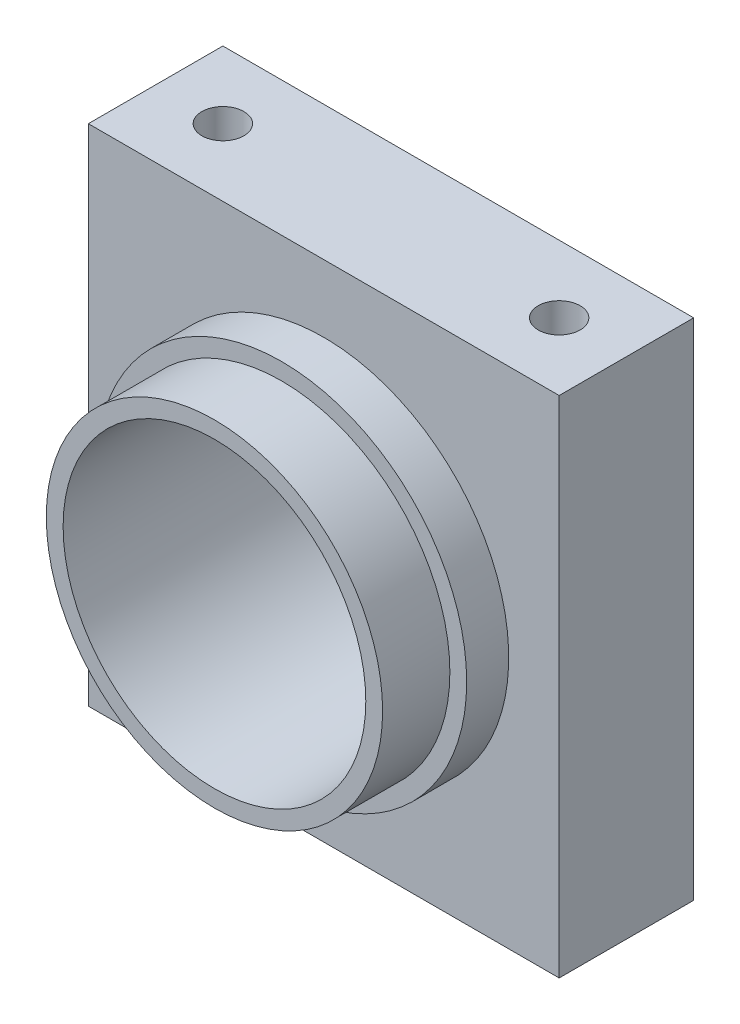
ISO-10303-21;
HEADER;
FILE_DESCRIPTION(('STEP AP214'),'2;1');
FILE_NAME('part.step','',(''),(''),'','','');
FILE_SCHEMA(('AUTOMOTIVE_DESIGN { 1 0 10303 214 1 1 1 1 }'));
ENDSEC;
DATA;
#1=APPLICATION_CONTEXT('core data for automotive mechanical design processes');
#2=APPLICATION_PROTOCOL_DEFINITION('international standard','automotive_design',2000,#1);
#3=PRODUCT_CONTEXT('',#1,'mechanical');
#4=PRODUCT('Part','Part','',(#3));
#5=PRODUCT_RELATED_PRODUCT_CATEGORY('part','',(#4));
#6=PRODUCT_DEFINITION_FORMATION('','',#4);
#7=PRODUCT_DEFINITION_CONTEXT('part definition',#1,'design');
#8=PRODUCT_DEFINITION('design','',#6,#7);
#9=PRODUCT_DEFINITION_SHAPE('','',#8);
#10=(LENGTH_UNIT() NAMED_UNIT(*) SI_UNIT(.MILLI.,.METRE.));
#11=(NAMED_UNIT(*) PLANE_ANGLE_UNIT() SI_UNIT($,.RADIAN.));
#12=(NAMED_UNIT(*) SI_UNIT($,.STERADIAN.) SOLID_ANGLE_UNIT());
#13=UNCERTAINTY_MEASURE_WITH_UNIT(LENGTH_MEASURE(1.E-05),#10,'distance_accuracy_value','');
#14=(GEOMETRIC_REPRESENTATION_CONTEXT(3) GLOBAL_UNCERTAINTY_ASSIGNED_CONTEXT((#13)) GLOBAL_UNIT_ASSIGNED_CONTEXT((#10,
#11,#12)) REPRESENTATION_CONTEXT('',''));
#15=CARTESIAN_POINT('',(0.,0.,0.));
#16=DIRECTION('',(0.,0.,1.));
#17=DIRECTION('',(1.,0.,0.));
#18=AXIS2_PLACEMENT_3D('',#15,#16,#17);
#19=CARTESIAN_POINT('',(0.,0.,10.5));
#20=DIRECTION('',(0.,0.,1.));
#21=DIRECTION('',(1.,0.,0.));
#22=AXIS2_PLACEMENT_3D('',#19,#20,#21);
#23=PLANE('',#22);
#24=CARTESIAN_POINT('',(0.,0.,10.5));
#25=DIRECTION('',(0.,0.,1.));
#26=DIRECTION('',(1.,0.,0.));
#27=AXIS2_PLACEMENT_3D('',#24,#25,#26);
#28=CIRCLE('',#27,11.);
#29=CARTESIAN_POINT('',(11.,0.,10.5));
#30=VERTEX_POINT('',#29);
#31=EDGE_CURVE('E140',#30,#30,#28,.T.);
#32=ORIENTED_EDGE('',*,*,#31,.T.);
#33=EDGE_LOOP('',(#32));
#34=FACE_BOUND('',#33,.T.);
#35=CARTESIAN_POINT('',(0.,0.,10.5));
#36=DIRECTION('',(0.,0.,1.));
#37=DIRECTION('',(1.,0.,0.));
#38=AXIS2_PLACEMENT_3D('',#35,#36,#37);
#39=CIRCLE('',#38,10.);
#40=CARTESIAN_POINT('',(10.,0.,10.5));
#41=VERTEX_POINT('',#40);
#42=EDGE_CURVE('E136',#41,#41,#39,.T.);
#43=ORIENTED_EDGE('',*,*,#42,.F.);
#44=EDGE_LOOP('',(#43));
#45=FACE_BOUND('',#44,.T.);
#46=ADVANCED_FACE('F38',(#34,#45),#23,.T.);
#47=CARTESIAN_POINT('',(0.,0.,8.));
#48=DIRECTION('',(0.,0.,-1.));
#49=DIRECTION('',(-1.,0.,0.));
#50=AXIS2_PLACEMENT_3D('',#47,#48,#49);
#51=PLANE('',#50);
#52=DIRECTION('',(0.,1.,0.));
#53=VECTOR('',#52,1.);
#54=CARTESIAN_POINT('',(14.,-15.,8.));
#55=LINE('',#54,#53);
#56=CARTESIAN_POINT('',(14.,-15.,8.));
#57=VERTEX_POINT('',#56);
#58=CARTESIAN_POINT('',(14.,15.,8.));
#59=VERTEX_POINT('',#58);
#60=EDGE_CURVE('E149',#57,#59,#55,.T.);
#61=ORIENTED_EDGE('',*,*,#60,.T.);
#62=DIRECTION('',(-1.,0.,0.));
#63=VECTOR('',#62,1.);
#64=CARTESIAN_POINT('',(-14.,15.,8.));
#65=LINE('',#64,#63);
#66=CARTESIAN_POINT('',(-14.,15.,8.));
#67=VERTEX_POINT('',#66);
#68=EDGE_CURVE('E87',#59,#67,#65,.T.);
#69=ORIENTED_EDGE('',*,*,#68,.T.);
#70=DIRECTION('',(0.,-1.,0.));
#71=VECTOR('',#70,1.);
#72=CARTESIAN_POINT('',(-14.,-15.,8.));
#73=LINE('',#72,#71);
#74=CARTESIAN_POINT('',(-14.,-15.,8.));
#75=VERTEX_POINT('',#74);
#76=EDGE_CURVE('E152',#67,#75,#73,.T.);
#77=ORIENTED_EDGE('',*,*,#76,.T.);
#78=DIRECTION('',(1.,0.,0.));
#79=VECTOR('',#78,1.);
#80=CARTESIAN_POINT('',(-14.,-15.,8.));
#81=LINE('',#80,#79);
#82=EDGE_CURVE('E55',#75,#57,#81,.T.);
#83=ORIENTED_EDGE('',*,*,#82,.T.);
#84=EDGE_LOOP('',(#61,#69,#77,#83));
#85=FACE_BOUND('',#84,.T.);
#86=CARTESIAN_POINT('',(0.,0.,8.));
#87=DIRECTION('',(0.,0.,-1.));
#88=DIRECTION('',(-1.,0.,0.));
#89=AXIS2_PLACEMENT_3D('',#86,#87,#88);
#90=CIRCLE('',#89,11.);
#91=CARTESIAN_POINT('',(-11.,0.,8.));
#92=VERTEX_POINT('',#91);
#93=EDGE_CURVE('E11',#92,#92,#90,.F.);
#94=ORIENTED_EDGE('',*,*,#93,.F.);
#95=EDGE_LOOP('',(#94));
#96=FACE_BOUND('',#95,.T.);
#97=ADVANCED_FACE('F175',(#85,#96),#51,.F.);
#98=CARTESIAN_POINT('',(0.,0.,0.));
#99=DIRECTION('',(0.,0.,-1.));
#100=DIRECTION('',(-1.,0.,0.));
#101=AXIS2_PLACEMENT_3D('',#98,#99,#100);
#102=PLANE('',#101);
#103=DIRECTION('',(0.,1.,0.));
#104=VECTOR('',#103,1.);
#105=CARTESIAN_POINT('',(14.,-15.,0.));
#106=LINE('',#105,#104);
#107=CARTESIAN_POINT('',(14.,-15.,0.));
#108=VERTEX_POINT('',#107);
#109=CARTESIAN_POINT('',(14.,15.,0.));
#110=VERTEX_POINT('',#109);
#111=EDGE_CURVE('E148',#108,#110,#106,.T.);
#112=ORIENTED_EDGE('',*,*,#111,.F.);
#113=DIRECTION('',(1.,0.,0.));
#114=VECTOR('',#113,1.);
#115=CARTESIAN_POINT('',(-14.,-15.,0.));
#116=LINE('',#115,#114);
#117=CARTESIAN_POINT('',(-14.,-15.,0.));
#118=VERTEX_POINT('',#117);
#119=EDGE_CURVE('E79',#118,#108,#116,.T.);
#120=ORIENTED_EDGE('',*,*,#119,.F.);
#121=DIRECTION('',(0.,-1.,0.));
#122=VECTOR('',#121,1.);
#123=CARTESIAN_POINT('',(-14.,-15.,0.));
#124=LINE('',#123,#122);
#125=CARTESIAN_POINT('',(-14.,15.,0.));
#126=VERTEX_POINT('',#125);
#127=EDGE_CURVE('E73',#126,#118,#124,.T.);
#128=ORIENTED_EDGE('',*,*,#127,.F.);
#129=DIRECTION('',(-1.,0.,0.));
#130=VECTOR('',#129,1.);
#131=CARTESIAN_POINT('',(-14.,15.,0.));
#132=LINE('',#131,#130);
#133=EDGE_CURVE('E158',#110,#126,#132,.T.);
#134=ORIENTED_EDGE('',*,*,#133,.F.);
#135=EDGE_LOOP('',(#112,#120,#128,#134));
#136=FACE_BOUND('',#135,.T.);
#137=CARTESIAN_POINT('',(0.,0.,0.));
#138=DIRECTION('',(0.,0.,1.));
#139=DIRECTION('',(1.,0.,0.));
#140=AXIS2_PLACEMENT_3D('',#137,#138,#139);
#141=CIRCLE('',#140,9.);
#142=CARTESIAN_POINT('',(9.,0.,0.));
#143=VERTEX_POINT('',#142);
#144=EDGE_CURVE('E145',#143,#143,#141,.T.);
#145=ORIENTED_EDGE('',*,*,#144,.T.);
#146=EDGE_LOOP('',(#145));
#147=FACE_BOUND('',#146,.T.);
#148=ADVANCED_FACE('F172',(#136,#147),#102,.T.);
#149=CARTESIAN_POINT('',(14.,-15.,8.));
#150=DIRECTION('',(-1.,0.,0.));
#151=DIRECTION('',(0.,0.,1.));
#152=AXIS2_PLACEMENT_3D('',#149,#150,#151);
#153=PLANE('',#152);
#154=ORIENTED_EDGE('',*,*,#111,.T.);
#155=DIRECTION('',(0.,0.,-1.));
#156=VECTOR('',#155,1.);
#157=CARTESIAN_POINT('',(14.,15.,8.));
#158=LINE('',#157,#156);
#159=EDGE_CURVE('E47',#59,#110,#158,.T.);
#160=ORIENTED_EDGE('',*,*,#159,.F.);
#161=ORIENTED_EDGE('',*,*,#60,.F.);
#162=DIRECTION('',(0.,0.,-1.));
#163=VECTOR('',#162,1.);
#164=CARTESIAN_POINT('',(14.,-15.,8.));
#165=LINE('',#164,#163);
#166=EDGE_CURVE('E155',#57,#108,#165,.T.);
#167=ORIENTED_EDGE('',*,*,#166,.T.);
#168=EDGE_LOOP('',(#154,#160,#161,#167));
#169=FACE_BOUND('',#168,.T.);
#170=ADVANCED_FACE('F40',(#169),#153,.F.);
#171=CARTESIAN_POINT('',(-14.,15.,8.));
#172=DIRECTION('',(0.,-1.,0.));
#173=DIRECTION('',(0.,0.,-1.));
#174=AXIS2_PLACEMENT_3D('',#171,#172,#173);
#175=PLANE('',#174);
#176=CARTESIAN_POINT('',(-10.,15.,4.));
#177=DIRECTION('',(0.,1.,0.));
#178=DIRECTION('',(0.,0.,1.));
#179=AXIS2_PLACEMENT_3D('',#176,#177,#178);
#180=CIRCLE('',#179,1.24999999999999);
#181=CARTESIAN_POINT('',(-10.,15.,5.24999999999999));
#182=VERTEX_POINT('',#181);
#183=EDGE_CURVE('E121',#182,#182,#180,.T.);
#184=ORIENTED_EDGE('',*,*,#183,.F.);
#185=EDGE_LOOP('',(#184));
#186=FACE_BOUND('',#185,.T.);
#187=CARTESIAN_POINT('',(10.,15.,4.));
#188=DIRECTION('',(0.,1.,0.));
#189=DIRECTION('',(0.,0.,1.));
#190=AXIS2_PLACEMENT_3D('',#187,#188,#189);
#191=CIRCLE('',#190,1.24999999999999);
#192=CARTESIAN_POINT('',(10.,15.,5.24999999999999));
#193=VERTEX_POINT('',#192);
#194=EDGE_CURVE('E127',#193,#193,#191,.T.);
#195=ORIENTED_EDGE('',*,*,#194,.F.);
#196=EDGE_LOOP('',(#195));
#197=FACE_BOUND('',#196,.T.);
#198=ORIENTED_EDGE('',*,*,#133,.T.);
#199=DIRECTION('',(0.,0.,-1.));
#200=VECTOR('',#199,1.);
#201=CARTESIAN_POINT('',(-14.,15.,8.));
#202=LINE('',#201,#200);
#203=EDGE_CURVE('E165',#67,#126,#202,.T.);
#204=ORIENTED_EDGE('',*,*,#203,.F.);
#205=ORIENTED_EDGE('',*,*,#68,.F.);
#206=ORIENTED_EDGE('',*,*,#159,.T.);
#207=EDGE_LOOP('',(#198,#204,#205,#206));
#208=FACE_BOUND('',#207,.T.);
#209=ADVANCED_FACE('F167',(#186,#197,#208),#175,.F.);
#210=CARTESIAN_POINT('',(-14.,-15.,8.));
#211=DIRECTION('',(1.,0.,0.));
#212=DIRECTION('',(0.,0.,-1.));
#213=AXIS2_PLACEMENT_3D('',#210,#211,#212);
#214=PLANE('',#213);
#215=ORIENTED_EDGE('',*,*,#127,.T.);
#216=DIRECTION('',(0.,0.,-1.));
#217=VECTOR('',#216,1.);
#218=CARTESIAN_POINT('',(-14.,-15.,8.));
#219=LINE('',#218,#217);
#220=EDGE_CURVE('E163',#75,#118,#219,.T.);
#221=ORIENTED_EDGE('',*,*,#220,.F.);
#222=ORIENTED_EDGE('',*,*,#76,.F.);
#223=ORIENTED_EDGE('',*,*,#203,.T.);
#224=EDGE_LOOP('',(#215,#221,#222,#223));
#225=FACE_BOUND('',#224,.T.);
#226=ADVANCED_FACE('F213',(#225),#214,.F.);
#227=CARTESIAN_POINT('',(-14.,-15.,8.));
#228=DIRECTION('',(0.,1.,0.));
#229=DIRECTION('',(0.,0.,1.));
#230=AXIS2_PLACEMENT_3D('',#227,#228,#229);
#231=PLANE('',#230);
#232=CARTESIAN_POINT('',(10.,-15.,4.));
#233=DIRECTION('',(0.,-1.,0.));
#234=DIRECTION('',(0.,0.,-1.));
#235=AXIS2_PLACEMENT_3D('',#232,#233,#234);
#236=CIRCLE('',#235,1.24999999999999);
#237=CARTESIAN_POINT('',(10.,-15.,2.75000000000001));
#238=VERTEX_POINT('',#237);
#239=EDGE_CURVE('E111',#238,#238,#236,.T.);
#240=ORIENTED_EDGE('',*,*,#239,.F.);
#241=EDGE_LOOP('',(#240));
#242=FACE_BOUND('',#241,.T.);
#243=CARTESIAN_POINT('',(-10.,-15.,4.));
#244=DIRECTION('',(0.,-1.,0.));
#245=DIRECTION('',(0.,0.,-1.));
#246=AXIS2_PLACEMENT_3D('',#243,#244,#245);
#247=CIRCLE('',#246,1.24999999999999);
#248=CARTESIAN_POINT('',(-10.,-15.,2.75000000000001));
#249=VERTEX_POINT('',#248);
#250=EDGE_CURVE('E110',#249,#249,#247,.T.);
#251=ORIENTED_EDGE('',*,*,#250,.F.);
#252=EDGE_LOOP('',(#251));
#253=FACE_BOUND('',#252,.T.);
#254=ORIENTED_EDGE('',*,*,#119,.T.);
#255=ORIENTED_EDGE('',*,*,#166,.F.);
#256=ORIENTED_EDGE('',*,*,#82,.F.);
#257=ORIENTED_EDGE('',*,*,#220,.T.);
#258=EDGE_LOOP('',(#254,#255,#256,#257));
#259=FACE_BOUND('',#258,.T.);
#260=ADVANCED_FACE('F183',(#242,#253,#259),#231,.F.);
#261=CARTESIAN_POINT('',(0.,0.,8.));
#262=DIRECTION('',(0.,0.,-1.));
#263=DIRECTION('',(-1.,0.,0.));
#264=AXIS2_PLACEMENT_3D('',#261,#262,#263);
#265=CYLINDRICAL_SURFACE('',#264,9.);
#266=ORIENTED_EDGE('',*,*,#144,.F.);
#267=EDGE_LOOP('',(#266));
#268=FACE_BOUND('',#267,.T.);
#269=CARTESIAN_POINT('',(0.,0.,14.5));
#270=DIRECTION('',(0.,0.,1.));
#271=DIRECTION('',(1.,0.,0.));
#272=AXIS2_PLACEMENT_3D('',#269,#270,#271);
#273=CIRCLE('',#272,9.);
#274=CARTESIAN_POINT('',(9.,0.,14.5));
#275=VERTEX_POINT('',#274);
#276=EDGE_CURVE('E133',#275,#275,#273,.T.);
#277=ORIENTED_EDGE('',*,*,#276,.T.);
#278=EDGE_LOOP('',(#277));
#279=FACE_BOUND('',#278,.T.);
#280=ADVANCED_FACE('F179',(#268,#279),#265,.F.);
#281=CARTESIAN_POINT('',(0.,0.,10.5));
#282=DIRECTION('',(0.,0.,-1.));
#283=DIRECTION('',(-1.,0.,0.));
#284=AXIS2_PLACEMENT_3D('',#281,#282,#283);
#285=CYLINDRICAL_SURFACE('',#284,11.);
#286=ORIENTED_EDGE('',*,*,#31,.F.);
#287=EDGE_LOOP('',(#286));
#288=FACE_BOUND('',#287,.T.);
#289=ORIENTED_EDGE('',*,*,#93,.T.);
#290=EDGE_LOOP('',(#289));
#291=FACE_BOUND('',#290,.T.);
#292=ADVANCED_FACE('F182',(#288,#291),#285,.T.);
#293=CARTESIAN_POINT('',(0.,0.,14.5));
#294=DIRECTION('',(0.,0.,1.));
#295=DIRECTION('',(1.,0.,0.));
#296=AXIS2_PLACEMENT_3D('',#293,#294,#295);
#297=PLANE('',#296);
#298=CARTESIAN_POINT('',(0.,0.,14.5));
#299=DIRECTION('',(0.,0.,1.));
#300=DIRECTION('',(1.,0.,0.));
#301=AXIS2_PLACEMENT_3D('',#298,#299,#300);
#302=CIRCLE('',#301,10.);
#303=CARTESIAN_POINT('',(10.,0.,14.5));
#304=VERTEX_POINT('',#303);
#305=EDGE_CURVE('E137',#304,#304,#302,.T.);
#306=ORIENTED_EDGE('',*,*,#305,.T.);
#307=EDGE_LOOP('',(#306));
#308=FACE_BOUND('',#307,.T.);
#309=ORIENTED_EDGE('',*,*,#276,.F.);
#310=EDGE_LOOP('',(#309));
#311=FACE_BOUND('',#310,.T.);
#312=ADVANCED_FACE('F187',(#308,#311),#297,.T.);
#313=CARTESIAN_POINT('',(0.,0.,14.5));
#314=DIRECTION('',(0.,0.,-1.));
#315=DIRECTION('',(-1.,0.,0.));
#316=AXIS2_PLACEMENT_3D('',#313,#314,#315);
#317=CYLINDRICAL_SURFACE('',#316,10.);
#318=ORIENTED_EDGE('',*,*,#305,.F.);
#319=EDGE_LOOP('',(#318));
#320=FACE_BOUND('',#319,.T.);
#321=ORIENTED_EDGE('',*,*,#42,.T.);
#322=EDGE_LOOP('',(#321));
#323=FACE_BOUND('',#322,.T.);
#324=ADVANCED_FACE('F189',(#320,#323),#317,.T.);
#325=CARTESIAN_POINT('',(10.,5.,4.));
#326=DIRECTION('',(0.,1.,0.));
#327=DIRECTION('',(0.,0.,1.));
#328=AXIS2_PLACEMENT_3D('',#325,#326,#327);
#329=CONICAL_SURFACE('',#328,1.25,1.02974425867665);
#330=CARTESIAN_POINT('',(10.,4.24892422621555,4.));
#331=VERTEX_POINT('',#330);
#332=VERTEX_LOOP('',#331);
#333=FACE_BOUND('',#332,.T.);
#334=CARTESIAN_POINT('',(10.,5.,4.));
#335=DIRECTION('',(0.,1.,0.));
#336=DIRECTION('',(0.,0.,1.));
#337=AXIS2_PLACEMENT_3D('',#334,#335,#336);
#338=CIRCLE('',#337,1.25);
#339=CARTESIAN_POINT('',(10.,5.,5.25));
#340=VERTEX_POINT('',#339);
#341=EDGE_CURVE('E130',#340,#340,#338,.T.);
#342=ORIENTED_EDGE('',*,*,#341,.T.);
#343=EDGE_LOOP('',(#342));
#344=FACE_BOUND('',#343,.T.);
#345=ADVANCED_FACE('F196',(#333,#344),#329,.F.);
#346=CARTESIAN_POINT('',(10.,15.,4.));
#347=DIRECTION('',(0.,1.,0.));
#348=DIRECTION('',(0.,0.,1.));
#349=AXIS2_PLACEMENT_3D('',#346,#347,#348);
#350=CYLINDRICAL_SURFACE('',#349,1.24999999999999);
#351=ORIENTED_EDGE('',*,*,#341,.F.);
#352=EDGE_LOOP('',(#351));
#353=FACE_BOUND('',#352,.T.);
#354=ORIENTED_EDGE('',*,*,#194,.T.);
#355=EDGE_LOOP('',(#354));
#356=FACE_BOUND('',#355,.T.);
#357=ADVANCED_FACE('F225',(#353,#356),#350,.F.);
#358=CARTESIAN_POINT('',(-10.,5.,4.));
#359=DIRECTION('',(0.,1.,0.));
#360=DIRECTION('',(0.,0.,1.));
#361=AXIS2_PLACEMENT_3D('',#358,#359,#360);
#362=CONICAL_SURFACE('',#361,1.25,1.02974425867665);
#363=CARTESIAN_POINT('',(-10.,4.24892422621555,4.));
#364=VERTEX_POINT('',#363);
#365=VERTEX_LOOP('',#364);
#366=FACE_BOUND('',#365,.T.);
#367=CARTESIAN_POINT('',(-10.,5.,4.));
#368=DIRECTION('',(0.,1.,0.));
#369=DIRECTION('',(0.,0.,1.));
#370=AXIS2_PLACEMENT_3D('',#367,#368,#369);
#371=CIRCLE('',#370,1.25);
#372=CARTESIAN_POINT('',(-10.,5.,5.25));
#373=VERTEX_POINT('',#372);
#374=EDGE_CURVE('E124',#373,#373,#371,.T.);
#375=ORIENTED_EDGE('',*,*,#374,.T.);
#376=EDGE_LOOP('',(#375));
#377=FACE_BOUND('',#376,.T.);
#378=ADVANCED_FACE('F227',(#366,#377),#362,.F.);
#379=CARTESIAN_POINT('',(-10.,15.,4.));
#380=DIRECTION('',(0.,1.,0.));
#381=DIRECTION('',(0.,0.,1.));
#382=AXIS2_PLACEMENT_3D('',#379,#380,#381);
#383=CYLINDRICAL_SURFACE('',#382,1.24999999999999);
#384=ORIENTED_EDGE('',*,*,#374,.F.);
#385=EDGE_LOOP('',(#384));
#386=FACE_BOUND('',#385,.T.);
#387=ORIENTED_EDGE('',*,*,#183,.T.);
#388=EDGE_LOOP('',(#387));
#389=FACE_BOUND('',#388,.T.);
#390=ADVANCED_FACE('F234',(#386,#389),#383,.F.);
#391=CARTESIAN_POINT('',(-10.,-5.00000000000001,4.));
#392=DIRECTION('',(0.,-1.,0.));
#393=DIRECTION('',(0.,0.,-1.));
#394=AXIS2_PLACEMENT_3D('',#391,#392,#393);
#395=CONICAL_SURFACE('',#394,1.24999999999999,1.02974425867664);
#396=CARTESIAN_POINT('',(-10.,-4.24892422621555,4.));
#397=VERTEX_POINT('',#396);
#398=VERTEX_LOOP('',#397);
#399=FACE_BOUND('',#398,.T.);
#400=CARTESIAN_POINT('',(-10.,-5.00000000000001,4.));
#401=DIRECTION('',(0.,-1.,0.));
#402=DIRECTION('',(0.,0.,-1.));
#403=AXIS2_PLACEMENT_3D('',#400,#401,#402);
#404=CIRCLE('',#403,1.24999999999999);
#405=CARTESIAN_POINT('',(-10.,-5.00000000000001,2.75000000000001));
#406=VERTEX_POINT('',#405);
#407=EDGE_CURVE('E114',#406,#406,#404,.T.);
#408=ORIENTED_EDGE('',*,*,#407,.T.);
#409=EDGE_LOOP('',(#408));
#410=FACE_BOUND('',#409,.T.);
#411=ADVANCED_FACE('F242',(#399,#410),#395,.F.);
#412=CARTESIAN_POINT('',(-10.,-15.,4.));
#413=DIRECTION('',(0.,-1.,0.));
#414=DIRECTION('',(0.,0.,-1.));
#415=AXIS2_PLACEMENT_3D('',#412,#413,#414);
#416=CYLINDRICAL_SURFACE('',#415,1.24999999999999);
#417=ORIENTED_EDGE('',*,*,#407,.F.);
#418=EDGE_LOOP('',(#417));
#419=FACE_BOUND('',#418,.T.);
#420=ORIENTED_EDGE('',*,*,#250,.T.);
#421=EDGE_LOOP('',(#420));
#422=FACE_BOUND('',#421,.T.);
#423=ADVANCED_FACE('F104',(#419,#422),#416,.F.);
#424=CARTESIAN_POINT('',(10.,-5.00000000000001,4.));
#425=DIRECTION('',(0.,-1.,0.));
#426=DIRECTION('',(0.,0.,-1.));
#427=AXIS2_PLACEMENT_3D('',#424,#425,#426);
#428=CONICAL_SURFACE('',#427,1.24999999999999,1.02974425867664);
#429=CARTESIAN_POINT('',(10.,-4.24892422621555,4.));
#430=VERTEX_POINT('',#429);
#431=VERTEX_LOOP('',#430);
#432=FACE_BOUND('',#431,.T.);
#433=CARTESIAN_POINT('',(10.,-5.00000000000001,4.));
#434=DIRECTION('',(0.,-1.,0.));
#435=DIRECTION('',(0.,0.,-1.));
#436=AXIS2_PLACEMENT_3D('',#433,#434,#435);
#437=CIRCLE('',#436,1.24999999999999);
#438=CARTESIAN_POINT('',(10.,-5.00000000000001,2.75000000000001));
#439=VERTEX_POINT('',#438);
#440=EDGE_CURVE('E108',#439,#439,#437,.T.);
#441=ORIENTED_EDGE('',*,*,#440,.T.);
#442=EDGE_LOOP('',(#441));
#443=FACE_BOUND('',#442,.T.);
#444=ADVANCED_FACE('F100',(#432,#443),#428,.F.);
#445=CARTESIAN_POINT('',(10.,-15.,4.));
#446=DIRECTION('',(0.,-1.,0.));
#447=DIRECTION('',(0.,0.,-1.));
#448=AXIS2_PLACEMENT_3D('',#445,#446,#447);
#449=CYLINDRICAL_SURFACE('',#448,1.24999999999999);
#450=ORIENTED_EDGE('',*,*,#440,.F.);
#451=EDGE_LOOP('',(#450));
#452=FACE_BOUND('',#451,.T.);
#453=ORIENTED_EDGE('',*,*,#239,.T.);
#454=EDGE_LOOP('',(#453));
#455=FACE_BOUND('',#454,.T.);
#456=ADVANCED_FACE('F103',(#452,#455),#449,.F.);
#457=CLOSED_SHELL('',(#46,#97,#148,#170,#209,#226,#260,#280,#292,#312,#324,#345,#357,#378,#390,
#411,#423,#444,#456));
#458=MANIFOLD_SOLID_BREP('B2',#457);
#459=ADVANCED_BREP_SHAPE_REPRESENTATION('',(#18,#458),#14);
#460=SHAPE_DEFINITION_REPRESENTATION(#9,#459);
ENDSEC;
END-ISO-10303-21;
